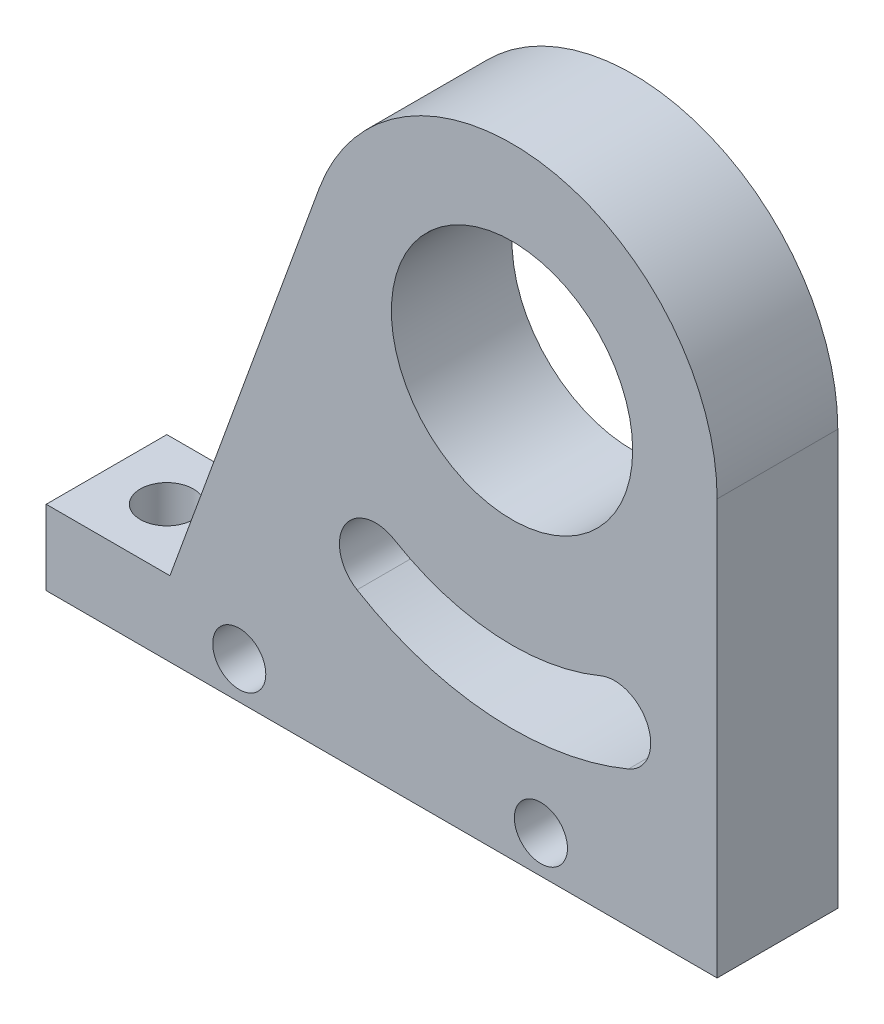
ISO-10303-21;
HEADER;
FILE_DESCRIPTION(('STEP AP214'),'2;1');
FILE_NAME('part.step','',(''),(''),'','','');
FILE_SCHEMA(('AUTOMOTIVE_DESIGN { 1 0 10303 214 1 1 1 1 }'));
ENDSEC;
DATA;
#1=APPLICATION_CONTEXT('core data for automotive mechanical design processes');
#2=APPLICATION_PROTOCOL_DEFINITION('international standard','automotive_design',2000,#1);
#3=PRODUCT_CONTEXT('',#1,'mechanical');
#4=PRODUCT('Part','Part','',(#3));
#5=PRODUCT_RELATED_PRODUCT_CATEGORY('part','',(#4));
#6=PRODUCT_DEFINITION_FORMATION('','',#4);
#7=PRODUCT_DEFINITION_CONTEXT('part definition',#1,'design');
#8=PRODUCT_DEFINITION('design','',#6,#7);
#9=PRODUCT_DEFINITION_SHAPE('','',#8);
#10=(LENGTH_UNIT() NAMED_UNIT(*) SI_UNIT(.MILLI.,.METRE.));
#11=(NAMED_UNIT(*) PLANE_ANGLE_UNIT() SI_UNIT($,.RADIAN.));
#12=(NAMED_UNIT(*) SI_UNIT($,.STERADIAN.) SOLID_ANGLE_UNIT());
#13=UNCERTAINTY_MEASURE_WITH_UNIT(LENGTH_MEASURE(1.E-05),#10,'distance_accuracy_value','');
#14=(GEOMETRIC_REPRESENTATION_CONTEXT(3) GLOBAL_UNCERTAINTY_ASSIGNED_CONTEXT((#13)) GLOBAL_UNIT_ASSIGNED_CONTEXT((#10,
#11,#12)) REPRESENTATION_CONTEXT('',''));
#15=CARTESIAN_POINT('',(0.,0.,0.));
#16=DIRECTION('',(0.,0.,1.));
#17=DIRECTION('',(1.,0.,0.));
#18=AXIS2_PLACEMENT_3D('',#15,#16,#17);
#19=CARTESIAN_POINT('',(0.,0.,10.));
#20=DIRECTION('',(0.,0.,-1.));
#21=DIRECTION('',(-1.,0.,0.));
#22=AXIS2_PLACEMENT_3D('',#19,#20,#21);
#23=PLANE('',#22);
#24=CARTESIAN_POINT('',(-22.607305144878,-31.2882049531371,10.));
#25=DIRECTION('',(0.,0.,1.));
#26=DIRECTION('',(1.,0.,0.));
#27=AXIS2_PLACEMENT_3D('',#24,#25,#26);
#28=CIRCLE('',#27,2.2);
#29=CARTESIAN_POINT('',(-20.407305144878,-31.2882049531371,10.));
#30=VERTEX_POINT('',#29);
#31=EDGE_CURVE('E325',#30,#30,#28,.T.);
#32=ORIENTED_EDGE('',*,*,#31,.F.);
#33=EDGE_LOOP('',(#32));
#34=FACE_BOUND('',#33,.T.);
#35=CARTESIAN_POINT('',(2.39269485512197,-31.2882049531371,10.));
#36=DIRECTION('',(0.,0.,1.));
#37=DIRECTION('',(1.,0.,0.));
#38=AXIS2_PLACEMENT_3D('',#35,#36,#37);
#39=CIRCLE('',#38,2.2);
#40=CARTESIAN_POINT('',(4.59269485512197,-31.2882049531371,10.));
#41=VERTEX_POINT('',#40);
#42=EDGE_CURVE('E340',#41,#41,#39,.T.);
#43=ORIENTED_EDGE('',*,*,#42,.F.);
#44=EDGE_LOOP('',(#43));
#45=FACE_BOUND('',#44,.T.);
#46=CARTESIAN_POINT('',(8.49126505829412,-20.2952806758072,10.));
#47=DIRECTION('',(0.,0.,1.));
#48=DIRECTION('',(-1.,0.,0.));
#49=AXIS2_PLACEMENT_3D('',#46,#47,#48);
#50=CIRCLE('',#49,3.);
#51=CARTESIAN_POINT('',(9.64916483897058,-23.0628189497809,10.));
#52=VERTEX_POINT('',#51);
#53=CARTESIAN_POINT('',(7.33336527761765,-17.5277424018335,10.));
#54=VERTEX_POINT('',#53);
#55=EDGE_CURVE('E168',#52,#54,#50,.T.);
#56=ORIENTED_EDGE('',*,*,#55,.F.);
#57=CARTESIAN_POINT('',(0.,0.,10.));
#58=DIRECTION('',(0.,0.,1.));
#59=DIRECTION('',(1.,0.,0.));
#60=AXIS2_PLACEMENT_3D('',#57,#58,#59);
#61=CIRCLE('',#60,25.);
#62=CARTESIAN_POINT('',(-12.8456113460427,-21.4473837366337,10.));
#63=VERTEX_POINT('',#62);
#64=EDGE_CURVE('E172',#63,#52,#61,.T.);
#65=ORIENTED_EDGE('',*,*,#64,.F.);
#66=CARTESIAN_POINT('',(-11.3041379845176,-18.8736976882377,10.));
#67=DIRECTION('',(0.,0.,1.));
#68=DIRECTION('',(1.,0.,0.));
#69=AXIS2_PLACEMENT_3D('',#66,#67,#68);
#70=CIRCLE('',#69,3.);
#71=CARTESIAN_POINT('',(-9.76266462299244,-16.3000116398416,10.));
#72=VERTEX_POINT('',#71);
#73=EDGE_CURVE('E164',#72,#63,#70,.T.);
#74=ORIENTED_EDGE('',*,*,#73,.F.);
#75=CARTESIAN_POINT('',(0.,0.,10.));
#76=DIRECTION('',(0.,0.,-1.));
#77=DIRECTION('',(1.,0.,0.));
#78=AXIS2_PLACEMENT_3D('',#75,#76,#77);
#79=CIRCLE('',#78,19.);
#80=EDGE_CURVE('E62',#54,#72,#79,.T.);
#81=ORIENTED_EDGE('',*,*,#80,.F.);
#82=EDGE_LOOP('',(#56,#65,#74,#81));
#83=FACE_BOUND('',#82,.T.);
#84=CARTESIAN_POINT('',(0.,0.,10.));
#85=DIRECTION('',(0.,0.,1.));
#86=DIRECTION('',(-1.,0.,0.));
#87=AXIS2_PLACEMENT_3D('',#84,#85,#86);
#88=CIRCLE('',#87,17.);
#89=CARTESIAN_POINT('',(17.,0.,10.));
#90=VERTEX_POINT('',#89);
#91=CARTESIAN_POINT('',(-15.9747745533604,5.81434243653638,10.));
#92=VERTEX_POINT('',#91);
#93=EDGE_CURVE('E213',#90,#92,#88,.T.);
#94=ORIENTED_EDGE('',*,*,#93,.T.);
#95=DIRECTION('',(-0.342020143325669,-0.939692620785908,0.));
#96=VECTOR('',#95,1.);
#97=CARTESIAN_POINT('',(-15.9747745533604,5.81434243653638,10.));
#98=LINE('',#97,#96);
#99=CARTESIAN_POINT('',(-28.3506896924276,-28.1882049531371,10.));
#100=VERTEX_POINT('',#99);
#101=EDGE_CURVE('E217',#92,#100,#98,.T.);
#102=ORIENTED_EDGE('',*,*,#101,.T.);
#103=DIRECTION('',(-1.,0.,0.));
#104=VECTOR('',#103,1.);
#105=CARTESIAN_POINT('',(-38.607305144878,-28.1882049531371,10.));
#106=LINE('',#105,#104);
#107=CARTESIAN_POINT('',(-38.607305144878,-28.1882049531371,10.));
#108=VERTEX_POINT('',#107);
#109=EDGE_CURVE('E156',#100,#108,#106,.T.);
#110=ORIENTED_EDGE('',*,*,#109,.T.);
#111=DIRECTION('',(0.,-1.,0.));
#112=VECTOR('',#111,1.);
#113=CARTESIAN_POINT('',(-38.607305144878,-34.3882049531371,10.));
#114=LINE('',#113,#112);
#115=CARTESIAN_POINT('',(-38.607305144878,-34.3882049531371,10.));
#116=VERTEX_POINT('',#115);
#117=EDGE_CURVE('E144',#108,#116,#114,.T.);
#118=ORIENTED_EDGE('',*,*,#117,.T.);
#119=DIRECTION('',(1.,0.,0.));
#120=VECTOR('',#119,1.);
#121=CARTESIAN_POINT('',(17.,-34.3882049531371,10.));
#122=LINE('',#121,#120);
#123=CARTESIAN_POINT('',(17.,-34.3882049531371,10.));
#124=VERTEX_POINT('',#123);
#125=EDGE_CURVE('E222',#116,#124,#122,.T.);
#126=ORIENTED_EDGE('',*,*,#125,.T.);
#127=DIRECTION('',(0.,1.,0.));
#128=VECTOR('',#127,1.);
#129=CARTESIAN_POINT('',(17.,0.,10.));
#130=LINE('',#129,#128);
#131=EDGE_CURVE('E225',#124,#90,#130,.T.);
#132=ORIENTED_EDGE('',*,*,#131,.T.);
#133=EDGE_LOOP('',(#94,#102,#110,#118,#126,#132));
#134=FACE_BOUND('',#133,.T.);
#135=CARTESIAN_POINT('',(0.,0.,10.));
#136=DIRECTION('',(0.,0.,1.));
#137=DIRECTION('',(1.,0.,0.));
#138=AXIS2_PLACEMENT_3D('',#135,#136,#137);
#139=CIRCLE('',#138,10.);
#140=CARTESIAN_POINT('',(10.,0.,10.));
#141=VERTEX_POINT('',#140);
#142=EDGE_CURVE('E205',#141,#141,#139,.T.);
#143=ORIENTED_EDGE('',*,*,#142,.F.);
#144=EDGE_LOOP('',(#143));
#145=FACE_BOUND('',#144,.T.);
#146=ADVANCED_FACE('F45',(#34,#45,#83,#134,#145),#23,.F.);
#147=CARTESIAN_POINT('',(0.,0.,0.));
#148=DIRECTION('',(0.,0.,-1.));
#149=DIRECTION('',(-1.,0.,0.));
#150=AXIS2_PLACEMENT_3D('',#147,#148,#149);
#151=PLANE('',#150);
#152=CARTESIAN_POINT('',(-22.607305144878,-31.2882049531371,0.));
#153=DIRECTION('',(0.,0.,-1.));
#154=DIRECTION('',(-1.,0.,0.));
#155=AXIS2_PLACEMENT_3D('',#152,#153,#154);
#156=CIRCLE('',#155,2.2);
#157=CARTESIAN_POINT('',(-24.807305144878,-31.2882049531371,0.));
#158=VERTEX_POINT('',#157);
#159=EDGE_CURVE('E328',#158,#158,#156,.F.);
#160=ORIENTED_EDGE('',*,*,#159,.T.);
#161=EDGE_LOOP('',(#160));
#162=FACE_BOUND('',#161,.T.);
#163=CARTESIAN_POINT('',(2.39269485512197,-31.2882049531371,0.));
#164=DIRECTION('',(0.,0.,-1.));
#165=DIRECTION('',(-1.,0.,0.));
#166=AXIS2_PLACEMENT_3D('',#163,#164,#165);
#167=CIRCLE('',#166,2.2);
#168=CARTESIAN_POINT('',(0.192694855121967,-31.2882049531371,0.));
#169=VERTEX_POINT('',#168);
#170=EDGE_CURVE('E337',#169,#169,#167,.F.);
#171=ORIENTED_EDGE('',*,*,#170,.T.);
#172=EDGE_LOOP('',(#171));
#173=FACE_BOUND('',#172,.T.);
#174=CARTESIAN_POINT('',(0.,0.,0.));
#175=DIRECTION('',(0.,0.,-1.));
#176=DIRECTION('',(-1.,0.,0.));
#177=AXIS2_PLACEMENT_3D('',#174,#175,#176);
#178=CIRCLE('',#177,25.);
#179=CARTESIAN_POINT('',(-12.8456113460427,-21.4473837366337,0.));
#180=VERTEX_POINT('',#179);
#181=CARTESIAN_POINT('',(9.64916483897058,-23.0628189497809,0.));
#182=VERTEX_POINT('',#181);
#183=EDGE_CURVE('E167',#180,#182,#178,.F.);
#184=ORIENTED_EDGE('',*,*,#183,.T.);
#185=CARTESIAN_POINT('',(8.49126505829412,-20.2952806758072,0.));
#186=DIRECTION('',(0.,0.,-1.));
#187=DIRECTION('',(-1.,0.,0.));
#188=AXIS2_PLACEMENT_3D('',#185,#186,#187);
#189=CIRCLE('',#188,3.);
#190=CARTESIAN_POINT('',(7.33336527761765,-17.5277424018335,0.));
#191=VERTEX_POINT('',#190);
#192=EDGE_CURVE('E192',#182,#191,#189,.F.);
#193=ORIENTED_EDGE('',*,*,#192,.T.);
#194=CARTESIAN_POINT('',(0.,0.,0.));
#195=DIRECTION('',(0.,0.,-1.));
#196=DIRECTION('',(-1.,0.,0.));
#197=AXIS2_PLACEMENT_3D('',#194,#195,#196);
#198=CIRCLE('',#197,19.);
#199=CARTESIAN_POINT('',(-9.76266462299244,-16.3000116398416,0.));
#200=VERTEX_POINT('',#199);
#201=EDGE_CURVE('E187',#191,#200,#198,.T.);
#202=ORIENTED_EDGE('',*,*,#201,.T.);
#203=CARTESIAN_POINT('',(-11.3041379845176,-18.8736976882377,0.));
#204=DIRECTION('',(0.,0.,-1.));
#205=DIRECTION('',(-1.,0.,0.));
#206=AXIS2_PLACEMENT_3D('',#203,#204,#205);
#207=CIRCLE('',#206,3.);
#208=EDGE_CURVE('E182',#200,#180,#207,.F.);
#209=ORIENTED_EDGE('',*,*,#208,.T.);
#210=EDGE_LOOP('',(#184,#193,#202,#209));
#211=FACE_BOUND('',#210,.T.);
#212=CARTESIAN_POINT('',(0.,0.,0.));
#213=DIRECTION('',(0.,0.,1.));
#214=DIRECTION('',(-1.,0.,0.));
#215=AXIS2_PLACEMENT_3D('',#212,#213,#214);
#216=CIRCLE('',#215,17.);
#217=CARTESIAN_POINT('',(17.,0.,0.));
#218=VERTEX_POINT('',#217);
#219=CARTESIAN_POINT('',(-15.9747745533604,5.81434243653638,0.));
#220=VERTEX_POINT('',#219);
#221=EDGE_CURVE('E209',#218,#220,#216,.T.);
#222=ORIENTED_EDGE('',*,*,#221,.F.);
#223=DIRECTION('',(0.,1.,0.));
#224=VECTOR('',#223,1.);
#225=CARTESIAN_POINT('',(17.,0.,0.));
#226=LINE('',#225,#224);
#227=CARTESIAN_POINT('',(17.,-34.3882049531371,0.));
#228=VERTEX_POINT('',#227);
#229=EDGE_CURVE('E218',#228,#218,#226,.T.);
#230=ORIENTED_EDGE('',*,*,#229,.F.);
#231=DIRECTION('',(1.,0.,0.));
#232=VECTOR('',#231,1.);
#233=CARTESIAN_POINT('',(17.,-34.3882049531371,0.));
#234=LINE('',#233,#232);
#235=CARTESIAN_POINT('',(-38.607305144878,-34.3882049531371,0.));
#236=VERTEX_POINT('',#235);
#237=EDGE_CURVE('E133',#236,#228,#234,.T.);
#238=ORIENTED_EDGE('',*,*,#237,.F.);
#239=DIRECTION('',(0.,-1.,0.));
#240=VECTOR('',#239,1.);
#241=CARTESIAN_POINT('',(-38.607305144878,-34.3882049531371,0.));
#242=LINE('',#241,#240);
#243=CARTESIAN_POINT('',(-38.607305144878,-28.1882049531371,0.));
#244=VERTEX_POINT('',#243);
#245=EDGE_CURVE('E124',#244,#236,#242,.T.);
#246=ORIENTED_EDGE('',*,*,#245,.F.);
#247=DIRECTION('',(-1.,0.,0.));
#248=VECTOR('',#247,1.);
#249=CARTESIAN_POINT('',(-38.607305144878,-28.1882049531371,0.));
#250=LINE('',#249,#248);
#251=CARTESIAN_POINT('',(-28.3506896924276,-28.1882049531371,0.));
#252=VERTEX_POINT('',#251);
#253=EDGE_CURVE('E130',#252,#244,#250,.T.);
#254=ORIENTED_EDGE('',*,*,#253,.F.);
#255=DIRECTION('',(-0.342020143325669,-0.939692620785908,0.));
#256=VECTOR('',#255,1.);
#257=CARTESIAN_POINT('',(-15.9747745533604,5.81434243653638,0.));
#258=LINE('',#257,#256);
#259=EDGE_CURVE('E232',#220,#252,#258,.T.);
#260=ORIENTED_EDGE('',*,*,#259,.F.);
#261=EDGE_LOOP('',(#222,#230,#238,#246,#254,#260));
#262=FACE_BOUND('',#261,.T.);
#263=CARTESIAN_POINT('',(0.,0.,0.));
#264=DIRECTION('',(0.,0.,1.));
#265=DIRECTION('',(1.,0.,0.));
#266=AXIS2_PLACEMENT_3D('',#263,#264,#265);
#267=CIRCLE('',#266,10.);
#268=CARTESIAN_POINT('',(10.,0.,0.));
#269=VERTEX_POINT('',#268);
#270=EDGE_CURVE('E204',#269,#269,#267,.T.);
#271=ORIENTED_EDGE('',*,*,#270,.T.);
#272=EDGE_LOOP('',(#271));
#273=FACE_BOUND('',#272,.T.);
#274=ADVANCED_FACE('F127',(#162,#173,#211,#262,#273),#151,.T.);
#275=CARTESIAN_POINT('',(0.,0.,10.));
#276=DIRECTION('',(0.,0.,-1.));
#277=DIRECTION('',(-1.,0.,0.));
#278=AXIS2_PLACEMENT_3D('',#275,#276,#277);
#279=CYLINDRICAL_SURFACE('',#278,17.);
#280=ORIENTED_EDGE('',*,*,#221,.T.);
#281=DIRECTION('',(0.,0.,-1.));
#282=VECTOR('',#281,1.);
#283=CARTESIAN_POINT('',(-15.9747745533604,5.81434243653638,10.));
#284=LINE('',#283,#282);
#285=EDGE_CURVE('E11',#92,#220,#284,.T.);
#286=ORIENTED_EDGE('',*,*,#285,.F.);
#287=ORIENTED_EDGE('',*,*,#93,.F.);
#288=DIRECTION('',(0.,0.,-1.));
#289=VECTOR('',#288,1.);
#290=CARTESIAN_POINT('',(17.,0.,10.));
#291=LINE('',#290,#289);
#292=EDGE_CURVE('E228',#90,#218,#291,.T.);
#293=ORIENTED_EDGE('',*,*,#292,.T.);
#294=EDGE_LOOP('',(#280,#286,#287,#293));
#295=FACE_BOUND('',#294,.T.);
#296=ADVANCED_FACE('F47',(#295),#279,.T.);
#297=CARTESIAN_POINT('',(-15.9747745533604,5.81434243653638,10.));
#298=DIRECTION('',(0.939692620785908,-0.342020143325669,0.));
#299=DIRECTION('',(0.342020143325669,0.939692620785908,0.));
#300=AXIS2_PLACEMENT_3D('',#297,#298,#299);
#301=PLANE('',#300);
#302=ORIENTED_EDGE('',*,*,#259,.T.);
#303=DIRECTION('',(0.,0.,1.));
#304=VECTOR('',#303,1.);
#305=CARTESIAN_POINT('',(-28.3506896924276,-28.1882049531371,-11.9849138728422));
#306=LINE('',#305,#304);
#307=EDGE_CURVE('E151',#252,#100,#306,.T.);
#308=ORIENTED_EDGE('',*,*,#307,.T.);
#309=ORIENTED_EDGE('',*,*,#101,.F.);
#310=ORIENTED_EDGE('',*,*,#285,.T.);
#311=EDGE_LOOP('',(#302,#308,#309,#310));
#312=FACE_BOUND('',#311,.T.);
#313=ADVANCED_FACE('F257',(#312),#301,.F.);
#314=CARTESIAN_POINT('',(17.,-34.3882049531371,10.));
#315=DIRECTION('',(0.,1.,0.));
#316=DIRECTION('',(-1.,0.,0.));
#317=AXIS2_PLACEMENT_3D('',#314,#315,#316);
#318=PLANE('',#317);
#319=CARTESIAN_POINT('',(-33.607305144878,-34.3882049531371,5.));
#320=DIRECTION('',(0.,-1.,0.));
#321=DIRECTION('',(1.,0.,0.));
#322=AXIS2_PLACEMENT_3D('',#319,#320,#321);
#323=CIRCLE('',#322,2.2);
#324=CARTESIAN_POINT('',(-31.407305144878,-34.3882049531371,5.));
#325=VERTEX_POINT('',#324);
#326=EDGE_CURVE('E347',#325,#325,#323,.T.);
#327=ORIENTED_EDGE('',*,*,#326,.F.);
#328=EDGE_LOOP('',(#327));
#329=FACE_BOUND('',#328,.T.);
#330=CARTESIAN_POINT('',(-8.60730514487804,-34.3882049531371,5.));
#331=DIRECTION('',(0.,-1.,0.));
#332=DIRECTION('',(1.,0.,0.));
#333=AXIS2_PLACEMENT_3D('',#330,#331,#332);
#334=CIRCLE('',#333,2.2);
#335=CARTESIAN_POINT('',(-6.40730514487804,-34.3882049531371,5.));
#336=VERTEX_POINT('',#335);
#337=EDGE_CURVE('E330',#336,#336,#334,.T.);
#338=ORIENTED_EDGE('',*,*,#337,.F.);
#339=EDGE_LOOP('',(#338));
#340=FACE_BOUND('',#339,.T.);
#341=ORIENTED_EDGE('',*,*,#237,.T.);
#342=DIRECTION('',(0.,0.,-1.));
#343=VECTOR('',#342,1.);
#344=CARTESIAN_POINT('',(17.,-34.3882049531371,10.));
#345=LINE('',#344,#343);
#346=EDGE_CURVE('E55',#124,#228,#345,.T.);
#347=ORIENTED_EDGE('',*,*,#346,.F.);
#348=ORIENTED_EDGE('',*,*,#125,.F.);
#349=DIRECTION('',(0.,0.,1.));
#350=VECTOR('',#349,1.);
#351=CARTESIAN_POINT('',(-38.607305144878,-34.3882049531371,-11.9849138728422));
#352=LINE('',#351,#350);
#353=EDGE_CURVE('E138',#236,#116,#352,.T.);
#354=ORIENTED_EDGE('',*,*,#353,.F.);
#355=EDGE_LOOP('',(#341,#347,#348,#354));
#356=FACE_BOUND('',#355,.T.);
#357=ADVANCED_FACE('F255',(#329,#340,#356),#318,.F.);
#358=CARTESIAN_POINT('',(17.,0.,10.));
#359=DIRECTION('',(-1.,0.,0.));
#360=DIRECTION('',(0.,0.,1.));
#361=AXIS2_PLACEMENT_3D('',#358,#359,#360);
#362=PLANE('',#361);
#363=ORIENTED_EDGE('',*,*,#229,.T.);
#364=ORIENTED_EDGE('',*,*,#292,.F.);
#365=ORIENTED_EDGE('',*,*,#131,.F.);
#366=ORIENTED_EDGE('',*,*,#346,.T.);
#367=EDGE_LOOP('',(#363,#364,#365,#366));
#368=FACE_BOUND('',#367,.T.);
#369=ADVANCED_FACE('F247',(#368),#362,.F.);
#370=CARTESIAN_POINT('',(0.,0.,10.));
#371=DIRECTION('',(0.,0.,-1.));
#372=DIRECTION('',(-1.,0.,0.));
#373=AXIS2_PLACEMENT_3D('',#370,#371,#372);
#374=CYLINDRICAL_SURFACE('',#373,10.);
#375=ORIENTED_EDGE('',*,*,#142,.T.);
#376=EDGE_LOOP('',(#375));
#377=FACE_BOUND('',#376,.T.);
#378=ORIENTED_EDGE('',*,*,#270,.F.);
#379=EDGE_LOOP('',(#378));
#380=FACE_BOUND('',#379,.T.);
#381=ADVANCED_FACE('F265',(#377,#380),#374,.F.);
#382=CARTESIAN_POINT('',(0.,0.,-27.3622406251165));
#383=DIRECTION('',(0.,0.,1.));
#384=DIRECTION('',(1.,0.,0.));
#385=AXIS2_PLACEMENT_3D('',#382,#383,#384);
#386=CYLINDRICAL_SURFACE('',#385,25.);
#387=DIRECTION('',(0.,0.,1.));
#388=VECTOR('',#387,1.);
#389=CARTESIAN_POINT('',(-12.8456113460427,-21.4473837366337,-27.3622406251165));
#390=LINE('',#389,#388);
#391=EDGE_CURVE('E70',#180,#63,#390,.T.);
#392=ORIENTED_EDGE('',*,*,#391,.T.);
#393=ORIENTED_EDGE('',*,*,#64,.T.);
#394=DIRECTION('',(0.,0.,1.));
#395=VECTOR('',#394,1.);
#396=CARTESIAN_POINT('',(9.64916483897058,-23.0628189497809,-27.3622406251165));
#397=LINE('',#396,#395);
#398=EDGE_CURVE('E181',#182,#52,#397,.T.);
#399=ORIENTED_EDGE('',*,*,#398,.F.);
#400=ORIENTED_EDGE('',*,*,#183,.F.);
#401=EDGE_LOOP('',(#392,#393,#399,#400));
#402=FACE_BOUND('',#401,.T.);
#403=ADVANCED_FACE('F285',(#402),#386,.F.);
#404=CARTESIAN_POINT('',(8.49126505829412,-20.2952806758072,-27.3622406251165));
#405=DIRECTION('',(0.,0.,1.));
#406=DIRECTION('',(1.,0.,0.));
#407=AXIS2_PLACEMENT_3D('',#404,#405,#406);
#408=CYLINDRICAL_SURFACE('',#407,3.);
#409=ORIENTED_EDGE('',*,*,#398,.T.);
#410=ORIENTED_EDGE('',*,*,#55,.T.);
#411=DIRECTION('',(0.,0.,1.));
#412=VECTOR('',#411,1.);
#413=CARTESIAN_POINT('',(7.33336527761765,-17.5277424018335,-27.3622406251165));
#414=LINE('',#413,#412);
#415=EDGE_CURVE('E191',#191,#54,#414,.T.);
#416=ORIENTED_EDGE('',*,*,#415,.F.);
#417=ORIENTED_EDGE('',*,*,#192,.F.);
#418=EDGE_LOOP('',(#409,#410,#416,#417));
#419=FACE_BOUND('',#418,.T.);
#420=ADVANCED_FACE('F289',(#419),#408,.F.);
#421=CARTESIAN_POINT('',(0.,0.,-27.3622406251165));
#422=DIRECTION('',(0.,0.,1.));
#423=DIRECTION('',(1.,0.,0.));
#424=AXIS2_PLACEMENT_3D('',#421,#422,#423);
#425=CYLINDRICAL_SURFACE('',#424,19.);
#426=ORIENTED_EDGE('',*,*,#415,.T.);
#427=ORIENTED_EDGE('',*,*,#80,.T.);
#428=DIRECTION('',(0.,0.,1.));
#429=VECTOR('',#428,1.);
#430=CARTESIAN_POINT('',(-9.76266462299244,-16.3000116398416,-27.3622406251165));
#431=LINE('',#430,#429);
#432=EDGE_CURVE('E186',#200,#72,#431,.T.);
#433=ORIENTED_EDGE('',*,*,#432,.F.);
#434=ORIENTED_EDGE('',*,*,#201,.F.);
#435=EDGE_LOOP('',(#426,#427,#433,#434));
#436=FACE_BOUND('',#435,.T.);
#437=ADVANCED_FACE('F293',(#436),#425,.T.);
#438=CARTESIAN_POINT('',(-11.3041379845176,-18.8736976882377,-27.3622406251165));
#439=DIRECTION('',(0.,0.,1.));
#440=DIRECTION('',(1.,0.,0.));
#441=AXIS2_PLACEMENT_3D('',#438,#439,#440);
#442=CYLINDRICAL_SURFACE('',#441,3.);
#443=ORIENTED_EDGE('',*,*,#432,.T.);
#444=ORIENTED_EDGE('',*,*,#73,.T.);
#445=ORIENTED_EDGE('',*,*,#391,.F.);
#446=ORIENTED_EDGE('',*,*,#208,.F.);
#447=EDGE_LOOP('',(#443,#444,#445,#446));
#448=FACE_BOUND('',#447,.T.);
#449=ADVANCED_FACE('F297',(#448),#442,.F.);
#450=CARTESIAN_POINT('',(-38.607305144878,-28.1882049531371,-11.9849138728422));
#451=DIRECTION('',(0.,1.,0.));
#452=DIRECTION('',(0.,0.,1.));
#453=AXIS2_PLACEMENT_3D('',#450,#451,#452);
#454=PLANE('',#453);
#455=CARTESIAN_POINT('',(-33.607305144878,-28.1882049531371,5.));
#456=DIRECTION('',(0.,1.,0.));
#457=DIRECTION('',(0.,0.,1.));
#458=AXIS2_PLACEMENT_3D('',#455,#456,#457);
#459=CIRCLE('',#458,2.2);
#460=CARTESIAN_POINT('',(-33.607305144878,-28.1882049531371,7.2));
#461=VERTEX_POINT('',#460);
#462=EDGE_CURVE('E49',#461,#461,#459,.T.);
#463=ORIENTED_EDGE('',*,*,#462,.F.);
#464=EDGE_LOOP('',(#463));
#465=FACE_BOUND('',#464,.T.);
#466=ORIENTED_EDGE('',*,*,#307,.F.);
#467=ORIENTED_EDGE('',*,*,#253,.T.);
#468=DIRECTION('',(0.,0.,1.));
#469=VECTOR('',#468,1.);
#470=CARTESIAN_POINT('',(-38.607305144878,-28.1882049531371,-11.9849138728422));
#471=LINE('',#470,#469);
#472=EDGE_CURVE('E139',#244,#108,#471,.T.);
#473=ORIENTED_EDGE('',*,*,#472,.T.);
#474=ORIENTED_EDGE('',*,*,#109,.F.);
#475=EDGE_LOOP('',(#466,#467,#473,#474));
#476=FACE_BOUND('',#475,.T.);
#477=ADVANCED_FACE('F149',(#465,#476),#454,.T.);
#478=CARTESIAN_POINT('',(-38.607305144878,-34.3882049531371,-11.9849138728422));
#479=DIRECTION('',(-1.,0.,0.));
#480=DIRECTION('',(0.,0.,1.));
#481=AXIS2_PLACEMENT_3D('',#478,#479,#480);
#482=PLANE('',#481);
#483=ORIENTED_EDGE('',*,*,#472,.F.);
#484=ORIENTED_EDGE('',*,*,#245,.T.);
#485=ORIENTED_EDGE('',*,*,#353,.T.);
#486=ORIENTED_EDGE('',*,*,#117,.F.);
#487=EDGE_LOOP('',(#483,#484,#485,#486));
#488=FACE_BOUND('',#487,.T.);
#489=ADVANCED_FACE('F142',(#488),#482,.T.);
#490=CARTESIAN_POINT('',(-33.607305144878,-26.3882049531371,5.));
#491=DIRECTION('',(0.,-1.,0.));
#492=DIRECTION('',(1.,0.,0.));
#493=AXIS2_PLACEMENT_3D('',#490,#491,#492);
#494=CYLINDRICAL_SURFACE('',#493,2.2);
#495=ORIENTED_EDGE('',*,*,#462,.T.);
#496=EDGE_LOOP('',(#495));
#497=FACE_BOUND('',#496,.T.);
#498=ORIENTED_EDGE('',*,*,#326,.T.);
#499=EDGE_LOOP('',(#498));
#500=FACE_BOUND('',#499,.T.);
#501=ADVANCED_FACE('F303',(#497,#500),#494,.F.);
#502=CARTESIAN_POINT('',(-8.60730514487804,-26.3882049531371,5.));
#503=DIRECTION('',(0.,-1.,0.));
#504=DIRECTION('',(1.,0.,0.));
#505=AXIS2_PLACEMENT_3D('',#502,#503,#504);
#506=CYLINDRICAL_SURFACE('',#505,2.2);
#507=CARTESIAN_POINT('',(-8.60730514487804,-26.3882049531371,5.));
#508=DIRECTION('',(0.,-1.,0.));
#509=DIRECTION('',(1.,0.,0.));
#510=AXIS2_PLACEMENT_3D('',#507,#508,#509);
#511=CIRCLE('',#510,2.2);
#512=CARTESIAN_POINT('',(-6.40730514487804,-26.3882049531371,5.));
#513=VERTEX_POINT('',#512);
#514=EDGE_CURVE('E335',#513,#513,#511,.T.);
#515=ORIENTED_EDGE('',*,*,#514,.F.);
#516=EDGE_LOOP('',(#515));
#517=FACE_BOUND('',#516,.T.);
#518=ORIENTED_EDGE('',*,*,#337,.T.);
#519=EDGE_LOOP('',(#518));
#520=FACE_BOUND('',#519,.T.);
#521=ADVANCED_FACE('F304',(#517,#520),#506,.F.);
#522=CARTESIAN_POINT('',(-8.60730514487804,-26.3882049531371,5.));
#523=DIRECTION('',(0.,-1.,0.));
#524=DIRECTION('',(1.,0.,0.));
#525=AXIS2_PLACEMENT_3D('',#522,#523,#524);
#526=PLANE('',#525);
#527=ORIENTED_EDGE('',*,*,#514,.T.);
#528=EDGE_LOOP('',(#527));
#529=FACE_BOUND('',#528,.T.);
#530=ADVANCED_FACE('F307',(#529),#526,.T.);
#531=CARTESIAN_POINT('',(2.39269485512197,-31.2882049531371,-6.22253967444162));
#532=DIRECTION('',(0.,0.,1.));
#533=DIRECTION('',(1.,0.,0.));
#534=AXIS2_PLACEMENT_3D('',#531,#532,#533);
#535=CYLINDRICAL_SURFACE('',#534,2.2);
#536=ORIENTED_EDGE('',*,*,#42,.T.);
#537=EDGE_LOOP('',(#536));
#538=FACE_BOUND('',#537,.T.);
#539=ORIENTED_EDGE('',*,*,#170,.F.);
#540=EDGE_LOOP('',(#539));
#541=FACE_BOUND('',#540,.T.);
#542=ADVANCED_FACE('F310',(#538,#541),#535,.F.);
#543=CARTESIAN_POINT('',(-22.607305144878,-31.2882049531371,-6.22253967444162));
#544=DIRECTION('',(0.,0.,1.));
#545=DIRECTION('',(1.,0.,0.));
#546=AXIS2_PLACEMENT_3D('',#543,#544,#545);
#547=CYLINDRICAL_SURFACE('',#546,2.2);
#548=ORIENTED_EDGE('',*,*,#31,.T.);
#549=EDGE_LOOP('',(#548));
#550=FACE_BOUND('',#549,.T.);
#551=ORIENTED_EDGE('',*,*,#159,.F.);
#552=EDGE_LOOP('',(#551));
#553=FACE_BOUND('',#552,.T.);
#554=ADVANCED_FACE('F317',(#550,#553),#547,.F.);
#555=CLOSED_SHELL('',(#146,#274,#296,#313,#357,#369,#381,#403,#420,#437,#449,#477,#489,#501,
#521,#530,#542,#554));
#556=MANIFOLD_SOLID_BREP('B2',#555);
#557=ADVANCED_BREP_SHAPE_REPRESENTATION('',(#18,#556),#14);
#558=SHAPE_DEFINITION_REPRESENTATION(#9,#557);
ENDSEC;
END-ISO-10303-21;
